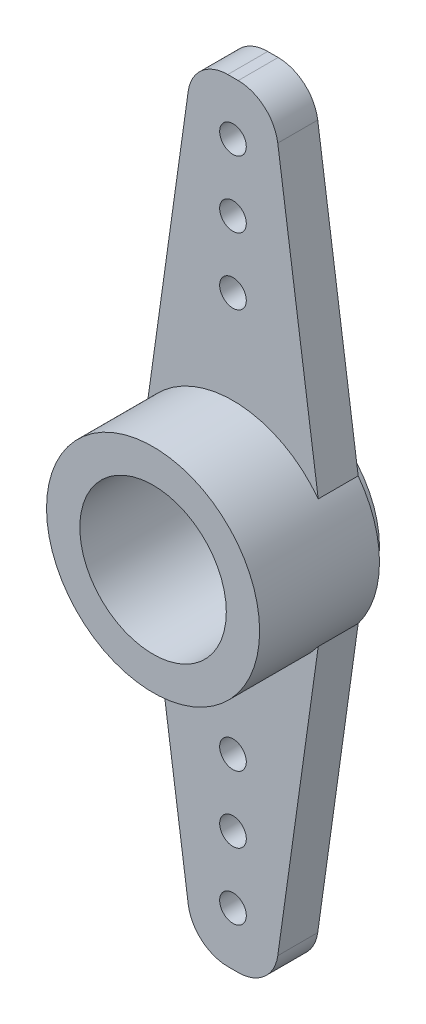
ISO-10303-21;
HEADER;
FILE_DESCRIPTION(('STEP AP214'),'2;1');
FILE_NAME('part.step','',(''),(''),'','','');
FILE_SCHEMA(('AUTOMOTIVE_DESIGN { 1 0 10303 214 1 1 1 1 }'));
ENDSEC;
DATA;
#1=APPLICATION_CONTEXT('core data for automotive mechanical design processes');
#2=APPLICATION_PROTOCOL_DEFINITION('international standard','automotive_design',2000,#1);
#3=PRODUCT_CONTEXT('',#1,'mechanical');
#4=PRODUCT('Part','Part','',(#3));
#5=PRODUCT_RELATED_PRODUCT_CATEGORY('part','',(#4));
#6=PRODUCT_DEFINITION_FORMATION('','',#4);
#7=PRODUCT_DEFINITION_CONTEXT('part definition',#1,'design');
#8=PRODUCT_DEFINITION('design','',#6,#7);
#9=PRODUCT_DEFINITION_SHAPE('','',#8);
#10=(LENGTH_UNIT() NAMED_UNIT(*) SI_UNIT(.MILLI.,.METRE.));
#11=(NAMED_UNIT(*) PLANE_ANGLE_UNIT() SI_UNIT($,.RADIAN.));
#12=(NAMED_UNIT(*) SI_UNIT($,.STERADIAN.) SOLID_ANGLE_UNIT());
#13=UNCERTAINTY_MEASURE_WITH_UNIT(LENGTH_MEASURE(1.E-05),#10,'distance_accuracy_value','');
#14=(GEOMETRIC_REPRESENTATION_CONTEXT(3) GLOBAL_UNCERTAINTY_ASSIGNED_CONTEXT((#13)) GLOBAL_UNIT_ASSIGNED_CONTEXT((#10,
#11,#12)) REPRESENTATION_CONTEXT('',''));
#15=CARTESIAN_POINT('',(0.,0.,0.));
#16=DIRECTION('',(0.,0.,1.));
#17=DIRECTION('',(1.,0.,0.));
#18=AXIS2_PLACEMENT_3D('',#15,#16,#17);
#19=CARTESIAN_POINT('',(0.,0.,1.5));
#20=DIRECTION('',(0.,0.,-1.));
#21=DIRECTION('',(-1.,0.,0.));
#22=AXIS2_PLACEMENT_3D('',#19,#20,#21);
#23=CYLINDRICAL_SURFACE('',#22,1.5);
#24=CARTESIAN_POINT('',(0.,0.,0.));
#25=DIRECTION('',(0.,0.,1.));
#26=DIRECTION('',(1.,0.,0.));
#27=AXIS2_PLACEMENT_3D('',#24,#25,#26);
#28=CIRCLE('',#27,1.5);
#29=CARTESIAN_POINT('',(1.5,0.,0.));
#30=VERTEX_POINT('',#29);
#31=EDGE_CURVE('E159',#30,#30,#28,.T.);
#32=ORIENTED_EDGE('',*,*,#31,.F.);
#33=EDGE_LOOP('',(#32));
#34=FACE_BOUND('',#33,.T.);
#35=CARTESIAN_POINT('',(0.,0.,0.5));
#36=DIRECTION('',(0.,0.,1.));
#37=DIRECTION('',(1.,0.,0.));
#38=AXIS2_PLACEMENT_3D('',#35,#36,#37);
#39=CIRCLE('',#38,1.5);
#40=CARTESIAN_POINT('',(1.5,0.,0.5));
#41=VERTEX_POINT('',#40);
#42=EDGE_CURVE('E37',#41,#41,#39,.T.);
#43=ORIENTED_EDGE('',*,*,#42,.T.);
#44=EDGE_LOOP('',(#43));
#45=FACE_BOUND('',#44,.T.);
#46=ADVANCED_FACE('F33',(#34,#45),#23,.F.);
#47=CARTESIAN_POINT('',(0.,0.,1.5));
#48=DIRECTION('',(0.,0.,1.));
#49=DIRECTION('',(1.,0.,0.));
#50=AXIS2_PLACEMENT_3D('',#47,#48,#49);
#51=PLANE('',#50);
#52=CARTESIAN_POINT('',(0.,0.,1.5));
#53=DIRECTION('',(0.,0.,1.));
#54=DIRECTION('',(1.,0.,0.));
#55=AXIS2_PLACEMENT_3D('',#52,#53,#54);
#56=CIRCLE('',#55,4.);
#57=CARTESIAN_POINT('',(3.2,2.4,1.5));
#58=VERTEX_POINT('',#57);
#59=CARTESIAN_POINT('',(-3.2,2.4,1.5));
#60=VERTEX_POINT('',#59);
#61=EDGE_CURVE('E208',#58,#60,#56,.T.);
#62=ORIENTED_EDGE('',*,*,#61,.F.);
#63=DIRECTION('',(-0.139129433730637,0.99027420478865,0.));
#64=VECTOR('',#63,1.);
#65=CARTESIAN_POINT('',(3.2,2.4,1.5));
#66=LINE('',#65,#64);
#67=CARTESIAN_POINT('',(1.68142313586669,13.2086941505959,1.5));
#68=VERTEX_POINT('',#67);
#69=EDGE_CURVE('E322',#58,#68,#66,.T.);
#70=ORIENTED_EDGE('',*,*,#69,.T.);
#71=CARTESIAN_POINT('',(0.196011828683711,13.,1.5));
#72=DIRECTION('',(0.,0.,1.));
#73=DIRECTION('',(1.,0.,0.));
#74=AXIS2_PLACEMENT_3D('',#71,#72,#73);
#75=CIRCLE('',#74,1.5);
#76=CARTESIAN_POINT('',(0.196011828683702,14.5,1.5));
#77=VERTEX_POINT('',#76);
#78=EDGE_CURVE('E137',#68,#77,#75,.T.);
#79=ORIENTED_EDGE('',*,*,#78,.T.);
#80=DIRECTION('',(-1.,0.,0.));
#81=VECTOR('',#80,1.);
#82=CARTESIAN_POINT('',(-0.196011828683702,14.5,1.5));
#83=LINE('',#82,#81);
#84=CARTESIAN_POINT('',(-0.196011828683702,14.5,1.5));
#85=VERTEX_POINT('',#84);
#86=EDGE_CURVE('E130',#77,#85,#83,.T.);
#87=ORIENTED_EDGE('',*,*,#86,.T.);
#88=CARTESIAN_POINT('',(-0.196011828683711,13.,1.5));
#89=DIRECTION('',(0.,0.,1.));
#90=DIRECTION('',(1.,0.,0.));
#91=AXIS2_PLACEMENT_3D('',#88,#89,#90);
#92=CIRCLE('',#91,1.5);
#93=CARTESIAN_POINT('',(-1.68142313586669,13.2086941505959,1.5));
#94=VERTEX_POINT('',#93);
#95=EDGE_CURVE('E135',#85,#94,#92,.T.);
#96=ORIENTED_EDGE('',*,*,#95,.T.);
#97=DIRECTION('',(-0.139129433730637,-0.99027420478865,0.));
#98=VECTOR('',#97,1.);
#99=CARTESIAN_POINT('',(-3.2,2.4,1.5));
#100=LINE('',#99,#98);
#101=EDGE_CURVE('E51',#94,#60,#100,.T.);
#102=ORIENTED_EDGE('',*,*,#101,.T.);
#103=EDGE_LOOP('',(#62,#70,#79,#87,#96,#102));
#104=FACE_BOUND('',#103,.T.);
#105=CARTESIAN_POINT('',(0.,12.5,1.5));
#106=DIRECTION('',(0.,0.,1.));
#107=DIRECTION('',(1.,0.,0.));
#108=AXIS2_PLACEMENT_3D('',#105,#106,#107);
#109=CIRCLE('',#108,0.5);
#110=CARTESIAN_POINT('',(0.5,12.5,1.5));
#111=VERTEX_POINT('',#110);
#112=EDGE_CURVE('E338',#111,#111,#109,.T.);
#113=ORIENTED_EDGE('',*,*,#112,.F.);
#114=EDGE_LOOP('',(#113));
#115=FACE_BOUND('',#114,.T.);
#116=CARTESIAN_POINT('',(0.,10.,1.5));
#117=DIRECTION('',(0.,0.,1.));
#118=DIRECTION('',(1.,0.,0.));
#119=AXIS2_PLACEMENT_3D('',#116,#117,#118);
#120=CIRCLE('',#119,0.5);
#121=CARTESIAN_POINT('',(0.5,10.,1.5));
#122=VERTEX_POINT('',#121);
#123=EDGE_CURVE('E334',#122,#122,#120,.T.);
#124=ORIENTED_EDGE('',*,*,#123,.F.);
#125=EDGE_LOOP('',(#124));
#126=FACE_BOUND('',#125,.T.);
#127=CARTESIAN_POINT('',(0.,7.5,1.5));
#128=DIRECTION('',(0.,0.,1.));
#129=DIRECTION('',(1.,0.,0.));
#130=AXIS2_PLACEMENT_3D('',#127,#128,#129);
#131=CIRCLE('',#130,0.5);
#132=CARTESIAN_POINT('',(0.5,7.5,1.5));
#133=VERTEX_POINT('',#132);
#134=EDGE_CURVE('E344',#133,#133,#131,.T.);
#135=ORIENTED_EDGE('',*,*,#134,.F.);
#136=EDGE_LOOP('',(#135));
#137=FACE_BOUND('',#136,.T.);
#138=ADVANCED_FACE('F132',(#104,#115,#126,#137),#51,.T.);
#139=CARTESIAN_POINT('',(-3.19999999999998,-2.40000000000005,1.5));
#140=VERTEX_POINT('',#139);
#141=CARTESIAN_POINT('',(3.20000000000001,-2.4,1.5));
#142=VERTEX_POINT('',#141);
#143=EDGE_CURVE('E43',#140,#142,#56,.T.);
#144=ORIENTED_EDGE('',*,*,#143,.F.);
#145=DIRECTION('',(0.139129433730644,-0.990274204788649,0.));
#146=VECTOR('',#145,1.);
#147=CARTESIAN_POINT('',(-3.19999999999998,-2.40000000000005,1.5));
#148=LINE('',#147,#146);
#149=CARTESIAN_POINT('',(-1.68142313586659,-13.208694150596,1.5));
#150=VERTEX_POINT('',#149);
#151=EDGE_CURVE('E178',#140,#150,#148,.T.);
#152=ORIENTED_EDGE('',*,*,#151,.T.);
#153=CARTESIAN_POINT('',(-0.19601182868362,-13.,1.5));
#154=DIRECTION('',(0.,0.,1.));
#155=DIRECTION('',(-1.,0.,0.));
#156=AXIS2_PLACEMENT_3D('',#153,#154,#155);
#157=CIRCLE('',#156,1.5);
#158=CARTESIAN_POINT('',(-0.1960118286836,-14.5,1.5));
#159=VERTEX_POINT('',#158);
#160=EDGE_CURVE('E329',#150,#159,#157,.T.);
#161=ORIENTED_EDGE('',*,*,#160,.T.);
#162=DIRECTION('',(1.,0.,0.));
#163=VECTOR('',#162,1.);
#164=CARTESIAN_POINT('',(-0.1960118286836,-14.5,1.5));
#165=LINE('',#164,#163);
#166=CARTESIAN_POINT('',(0.196011828683802,-14.5,1.5));
#167=VERTEX_POINT('',#166);
#168=EDGE_CURVE('E311',#159,#167,#165,.T.);
#169=ORIENTED_EDGE('',*,*,#168,.T.);
#170=CARTESIAN_POINT('',(0.196011828683801,-13.,1.5));
#171=DIRECTION('',(0.,0.,1.));
#172=DIRECTION('',(-1.,0.,0.));
#173=AXIS2_PLACEMENT_3D('',#170,#171,#172);
#174=CIRCLE('',#173,1.5);
#175=CARTESIAN_POINT('',(1.68142313586678,-13.208694150596,1.5));
#176=VERTEX_POINT('',#175);
#177=EDGE_CURVE('E323',#167,#176,#174,.T.);
#178=ORIENTED_EDGE('',*,*,#177,.T.);
#179=DIRECTION('',(0.13912943373063,0.990274204788651,0.));
#180=VECTOR('',#179,1.);
#181=CARTESIAN_POINT('',(3.20000000000002,-2.4,1.5));
#182=LINE('',#181,#180);
#183=EDGE_CURVE('E321',#176,#142,#182,.T.);
#184=ORIENTED_EDGE('',*,*,#183,.T.);
#185=EDGE_LOOP('',(#144,#152,#161,#169,#178,#184));
#186=FACE_BOUND('',#185,.T.);
#187=CARTESIAN_POINT('',(0.,-12.5,1.5));
#188=DIRECTION('',(0.,0.,1.));
#189=DIRECTION('',(-1.,0.,0.));
#190=AXIS2_PLACEMENT_3D('',#187,#188,#189);
#191=CIRCLE('',#190,0.500000000000001);
#192=CARTESIAN_POINT('',(-0.499999999999914,-12.5,1.5));
#193=VERTEX_POINT('',#192);
#194=EDGE_CURVE('E356',#193,#193,#191,.T.);
#195=ORIENTED_EDGE('',*,*,#194,.F.);
#196=EDGE_LOOP('',(#195));
#197=FACE_BOUND('',#196,.T.);
#198=CARTESIAN_POINT('',(0.,-7.50000000000003,1.5));
#199=DIRECTION('',(0.,0.,1.));
#200=DIRECTION('',(-1.,0.,0.));
#201=AXIS2_PLACEMENT_3D('',#198,#199,#200);
#202=CIRCLE('',#201,0.500000000000001);
#203=CARTESIAN_POINT('',(-0.499999999999949,-7.50000000000003,1.5));
#204=VERTEX_POINT('',#203);
#205=EDGE_CURVE('E350',#204,#204,#202,.T.);
#206=ORIENTED_EDGE('',*,*,#205,.F.);
#207=EDGE_LOOP('',(#206));
#208=FACE_BOUND('',#207,.T.);
#209=CARTESIAN_POINT('',(0.,-10.,1.5));
#210=DIRECTION('',(0.,0.,1.));
#211=DIRECTION('',(-1.,0.,0.));
#212=AXIS2_PLACEMENT_3D('',#209,#210,#211);
#213=CIRCLE('',#212,0.500000000000001);
#214=CARTESIAN_POINT('',(-0.499999999999931,-10.,1.5));
#215=VERTEX_POINT('',#214);
#216=EDGE_CURVE('E362',#215,#215,#213,.T.);
#217=ORIENTED_EDGE('',*,*,#216,.F.);
#218=EDGE_LOOP('',(#217));
#219=FACE_BOUND('',#218,.T.);
#220=ADVANCED_FACE('F256',(#186,#197,#208,#219),#51,.T.);
#221=CARTESIAN_POINT('',(0.,0.,0.));
#222=DIRECTION('',(0.,0.,1.));
#223=DIRECTION('',(1.,0.,0.));
#224=AXIS2_PLACEMENT_3D('',#221,#222,#223);
#225=PLANE('',#224);
#226=CARTESIAN_POINT('',(0.,0.,0.));
#227=DIRECTION('',(0.,0.,1.));
#228=DIRECTION('',(1.,0.,0.));
#229=AXIS2_PLACEMENT_3D('',#226,#227,#228);
#230=CIRCLE('',#229,3.5);
#231=CARTESIAN_POINT('',(3.5,0.,0.));
#232=VERTEX_POINT('',#231);
#233=EDGE_CURVE('E11',#232,#232,#230,.F.);
#234=ORIENTED_EDGE('',*,*,#233,.F.);
#235=EDGE_LOOP('',(#234));
#236=FACE_BOUND('',#235,.T.);
#237=CARTESIAN_POINT('',(0.,0.,0.));
#238=DIRECTION('',(0.,0.,1.));
#239=DIRECTION('',(1.,0.,0.));
#240=AXIS2_PLACEMENT_3D('',#237,#238,#239);
#241=CIRCLE('',#240,4.00000000000001);
#242=CARTESIAN_POINT('',(-3.2,2.4,0.));
#243=VERTEX_POINT('',#242);
#244=CARTESIAN_POINT('',(-3.19999999999998,-2.40000000000005,0.));
#245=VERTEX_POINT('',#244);
#246=EDGE_CURVE('E155',#243,#245,#241,.T.);
#247=ORIENTED_EDGE('',*,*,#246,.F.);
#248=DIRECTION('',(-0.139129433730637,-0.99027420478865,0.));
#249=VECTOR('',#248,1.);
#250=CARTESIAN_POINT('',(-3.2,2.4,0.));
#251=LINE('',#250,#249);
#252=CARTESIAN_POINT('',(-1.68142313586669,13.2086941505959,0.));
#253=VERTEX_POINT('',#252);
#254=EDGE_CURVE('E99',#253,#243,#251,.T.);
#255=ORIENTED_EDGE('',*,*,#254,.F.);
#256=CARTESIAN_POINT('',(-0.196011828683711,13.,0.));
#257=DIRECTION('',(0.,0.,1.));
#258=DIRECTION('',(1.,0.,0.));
#259=AXIS2_PLACEMENT_3D('',#256,#257,#258);
#260=CIRCLE('',#259,1.5);
#261=CARTESIAN_POINT('',(-0.196011828683702,14.5,0.));
#262=VERTEX_POINT('',#261);
#263=EDGE_CURVE('E93',#262,#253,#260,.T.);
#264=ORIENTED_EDGE('',*,*,#263,.F.);
#265=DIRECTION('',(-1.,0.,0.));
#266=VECTOR('',#265,1.);
#267=CARTESIAN_POINT('',(-0.196011828683702,14.5,0.));
#268=LINE('',#267,#266);
#269=CARTESIAN_POINT('',(0.196011828683702,14.5,0.));
#270=VERTEX_POINT('',#269);
#271=EDGE_CURVE('E145',#270,#262,#268,.T.);
#272=ORIENTED_EDGE('',*,*,#271,.F.);
#273=CARTESIAN_POINT('',(0.196011828683711,13.,0.));
#274=DIRECTION('',(0.,0.,1.));
#275=DIRECTION('',(1.,0.,0.));
#276=AXIS2_PLACEMENT_3D('',#273,#274,#275);
#277=CIRCLE('',#276,1.5);
#278=CARTESIAN_POINT('',(1.68142313586669,13.2086941505959,0.));
#279=VERTEX_POINT('',#278);
#280=EDGE_CURVE('E173',#279,#270,#277,.T.);
#281=ORIENTED_EDGE('',*,*,#280,.F.);
#282=DIRECTION('',(-0.139129433730637,0.99027420478865,0.));
#283=VECTOR('',#282,1.);
#284=CARTESIAN_POINT('',(3.2,2.4,0.));
#285=LINE('',#284,#283);
#286=CARTESIAN_POINT('',(3.2,2.4,0.));
#287=VERTEX_POINT('',#286);
#288=EDGE_CURVE('E171',#287,#279,#285,.T.);
#289=ORIENTED_EDGE('',*,*,#288,.F.);
#290=CARTESIAN_POINT('',(0.,0.,0.));
#291=DIRECTION('',(0.,0.,1.));
#292=DIRECTION('',(1.,0.,0.));
#293=AXIS2_PLACEMENT_3D('',#290,#291,#292);
#294=CIRCLE('',#293,4.00000000000001);
#295=CARTESIAN_POINT('',(3.20000000000001,-2.4,0.));
#296=VERTEX_POINT('',#295);
#297=EDGE_CURVE('E169',#296,#287,#294,.T.);
#298=ORIENTED_EDGE('',*,*,#297,.F.);
#299=DIRECTION('',(0.13912943373063,0.990274204788651,0.));
#300=VECTOR('',#299,1.);
#301=CARTESIAN_POINT('',(3.20000000000002,-2.4,0.));
#302=LINE('',#301,#300);
#303=CARTESIAN_POINT('',(1.68142313586678,-13.208694150596,0.));
#304=VERTEX_POINT('',#303);
#305=EDGE_CURVE('E167',#304,#296,#302,.T.);
#306=ORIENTED_EDGE('',*,*,#305,.F.);
#307=CARTESIAN_POINT('',(0.196011828683801,-13.,0.));
#308=DIRECTION('',(0.,0.,1.));
#309=DIRECTION('',(-1.,0.,0.));
#310=AXIS2_PLACEMENT_3D('',#307,#308,#309);
#311=CIRCLE('',#310,1.5);
#312=CARTESIAN_POINT('',(0.196011828683802,-14.5,0.));
#313=VERTEX_POINT('',#312);
#314=EDGE_CURVE('E165',#313,#304,#311,.T.);
#315=ORIENTED_EDGE('',*,*,#314,.F.);
#316=DIRECTION('',(1.,0.,0.));
#317=VECTOR('',#316,1.);
#318=CARTESIAN_POINT('',(-0.1960118286836,-14.5,0.));
#319=LINE('',#318,#317);
#320=CARTESIAN_POINT('',(-0.1960118286836,-14.5,0.));
#321=VERTEX_POINT('',#320);
#322=EDGE_CURVE('E163',#321,#313,#319,.T.);
#323=ORIENTED_EDGE('',*,*,#322,.F.);
#324=CARTESIAN_POINT('',(-0.19601182868362,-13.,0.));
#325=DIRECTION('',(0.,0.,1.));
#326=DIRECTION('',(-1.,0.,0.));
#327=AXIS2_PLACEMENT_3D('',#324,#325,#326);
#328=CIRCLE('',#327,1.5);
#329=CARTESIAN_POINT('',(-1.68142313586659,-13.208694150596,0.));
#330=VERTEX_POINT('',#329);
#331=EDGE_CURVE('E161',#330,#321,#328,.T.);
#332=ORIENTED_EDGE('',*,*,#331,.F.);
#333=DIRECTION('',(0.139129433730644,-0.990274204788649,0.));
#334=VECTOR('',#333,1.);
#335=CARTESIAN_POINT('',(-3.19999999999998,-2.40000000000005,0.));
#336=LINE('',#335,#334);
#337=EDGE_CURVE('E158',#245,#330,#336,.T.);
#338=ORIENTED_EDGE('',*,*,#337,.F.);
#339=EDGE_LOOP('',(#247,#255,#264,#272,#281,#289,#298,#306,#315,#323,#332,#338));
#340=FACE_BOUND('',#339,.T.);
#341=CARTESIAN_POINT('',(0.,10.,0.));
#342=DIRECTION('',(0.,0.,1.));
#343=DIRECTION('',(1.,0.,0.));
#344=AXIS2_PLACEMENT_3D('',#341,#342,#343);
#345=CIRCLE('',#344,0.5);
#346=CARTESIAN_POINT('',(0.5,10.,0.));
#347=VERTEX_POINT('',#346);
#348=EDGE_CURVE('E335',#347,#347,#345,.T.);
#349=ORIENTED_EDGE('',*,*,#348,.T.);
#350=EDGE_LOOP('',(#349));
#351=FACE_BOUND('',#350,.T.);
#352=CARTESIAN_POINT('',(0.,12.5,0.));
#353=DIRECTION('',(0.,0.,1.));
#354=DIRECTION('',(1.,0.,0.));
#355=AXIS2_PLACEMENT_3D('',#352,#353,#354);
#356=CIRCLE('',#355,0.5);
#357=CARTESIAN_POINT('',(0.5,12.5,0.));
#358=VERTEX_POINT('',#357);
#359=EDGE_CURVE('E341',#358,#358,#356,.T.);
#360=ORIENTED_EDGE('',*,*,#359,.T.);
#361=EDGE_LOOP('',(#360));
#362=FACE_BOUND('',#361,.T.);
#363=CARTESIAN_POINT('',(0.,7.5,0.));
#364=DIRECTION('',(0.,0.,1.));
#365=DIRECTION('',(1.,0.,0.));
#366=AXIS2_PLACEMENT_3D('',#363,#364,#365);
#367=CIRCLE('',#366,0.5);
#368=CARTESIAN_POINT('',(0.5,7.5,0.));
#369=VERTEX_POINT('',#368);
#370=EDGE_CURVE('E347',#369,#369,#367,.T.);
#371=ORIENTED_EDGE('',*,*,#370,.T.);
#372=EDGE_LOOP('',(#371));
#373=FACE_BOUND('',#372,.T.);
#374=CARTESIAN_POINT('',(0.,-7.50000000000003,0.));
#375=DIRECTION('',(0.,0.,1.));
#376=DIRECTION('',(-1.,0.,0.));
#377=AXIS2_PLACEMENT_3D('',#374,#375,#376);
#378=CIRCLE('',#377,0.500000000000001);
#379=CARTESIAN_POINT('',(-0.499999999999949,-7.50000000000003,0.));
#380=VERTEX_POINT('',#379);
#381=EDGE_CURVE('E353',#380,#380,#378,.T.);
#382=ORIENTED_EDGE('',*,*,#381,.T.);
#383=EDGE_LOOP('',(#382));
#384=FACE_BOUND('',#383,.T.);
#385=CARTESIAN_POINT('',(0.,-12.5,0.));
#386=DIRECTION('',(0.,0.,1.));
#387=DIRECTION('',(-1.,0.,0.));
#388=AXIS2_PLACEMENT_3D('',#385,#386,#387);
#389=CIRCLE('',#388,0.500000000000001);
#390=CARTESIAN_POINT('',(-0.499999999999914,-12.5,0.));
#391=VERTEX_POINT('',#390);
#392=EDGE_CURVE('E359',#391,#391,#389,.T.);
#393=ORIENTED_EDGE('',*,*,#392,.T.);
#394=EDGE_LOOP('',(#393));
#395=FACE_BOUND('',#394,.T.);
#396=CARTESIAN_POINT('',(0.,-10.,0.));
#397=DIRECTION('',(0.,0.,1.));
#398=DIRECTION('',(-1.,0.,0.));
#399=AXIS2_PLACEMENT_3D('',#396,#397,#398);
#400=CIRCLE('',#399,0.500000000000001);
#401=CARTESIAN_POINT('',(-0.499999999999931,-10.,0.));
#402=VERTEX_POINT('',#401);
#403=EDGE_CURVE('E217',#402,#402,#400,.T.);
#404=ORIENTED_EDGE('',*,*,#403,.T.);
#405=EDGE_LOOP('',(#404));
#406=FACE_BOUND('',#405,.T.);
#407=ADVANCED_FACE('F264',(#236,#340,#351,#362,#373,#384,#395,#406),#225,.F.);
#408=CARTESIAN_POINT('',(-3.19999999999998,-2.40000000000005,1.5));
#409=DIRECTION('',(0.990274204788649,0.139129433730644,0.));
#410=DIRECTION('',(-0.139129433730644,0.990274204788649,0.));
#411=AXIS2_PLACEMENT_3D('',#408,#409,#410);
#412=PLANE('',#411);
#413=ORIENTED_EDGE('',*,*,#337,.T.);
#414=DIRECTION('',(0.,0.,-1.));
#415=VECTOR('',#414,1.);
#416=CARTESIAN_POINT('',(-1.68142313586659,-13.208694150596,1.5));
#417=LINE('',#416,#415);
#418=EDGE_CURVE('E200',#150,#330,#417,.T.);
#419=ORIENTED_EDGE('',*,*,#418,.F.);
#420=ORIENTED_EDGE('',*,*,#151,.F.);
#421=DIRECTION('',(0.,0.,-1.));
#422=VECTOR('',#421,1.);
#423=CARTESIAN_POINT('',(-3.19999999999998,-2.40000000000005,1.5));
#424=LINE('',#423,#422);
#425=EDGE_CURVE('E203',#140,#245,#424,.T.);
#426=ORIENTED_EDGE('',*,*,#425,.T.);
#427=EDGE_LOOP('',(#413,#419,#420,#426));
#428=FACE_BOUND('',#427,.T.);
#429=ADVANCED_FACE('F35',(#428),#412,.F.);
#430=CARTESIAN_POINT('',(-0.19601182868362,-13.,1.5));
#431=DIRECTION('',(0.,0.,-1.));
#432=DIRECTION('',(-1.,0.,0.));
#433=AXIS2_PLACEMENT_3D('',#430,#431,#432);
#434=CYLINDRICAL_SURFACE('',#433,1.5);
#435=ORIENTED_EDGE('',*,*,#331,.T.);
#436=DIRECTION('',(0.,0.,-1.));
#437=VECTOR('',#436,1.);
#438=CARTESIAN_POINT('',(-0.1960118286836,-14.5,1.5));
#439=LINE('',#438,#437);
#440=EDGE_CURVE('E197',#159,#321,#439,.T.);
#441=ORIENTED_EDGE('',*,*,#440,.F.);
#442=ORIENTED_EDGE('',*,*,#160,.F.);
#443=ORIENTED_EDGE('',*,*,#418,.T.);
#444=EDGE_LOOP('',(#435,#441,#442,#443));
#445=FACE_BOUND('',#444,.T.);
#446=ADVANCED_FACE('F296',(#445),#434,.T.);
#447=CARTESIAN_POINT('',(-0.1960118286836,-14.5,1.5));
#448=DIRECTION('',(0.,1.,0.));
#449=DIRECTION('',(0.,0.,1.));
#450=AXIS2_PLACEMENT_3D('',#447,#448,#449);
#451=PLANE('',#450);
#452=ORIENTED_EDGE('',*,*,#322,.T.);
#453=DIRECTION('',(0.,0.,-1.));
#454=VECTOR('',#453,1.);
#455=CARTESIAN_POINT('',(0.196011828683802,-14.5,1.5));
#456=LINE('',#455,#454);
#457=EDGE_CURVE('E194',#167,#313,#456,.T.);
#458=ORIENTED_EDGE('',*,*,#457,.F.);
#459=ORIENTED_EDGE('',*,*,#168,.F.);
#460=ORIENTED_EDGE('',*,*,#440,.T.);
#461=EDGE_LOOP('',(#452,#458,#459,#460));
#462=FACE_BOUND('',#461,.T.);
#463=ADVANCED_FACE('F293',(#462),#451,.F.);
#464=CARTESIAN_POINT('',(0.196011828683801,-13.,1.5));
#465=DIRECTION('',(0.,0.,-1.));
#466=DIRECTION('',(-1.,0.,0.));
#467=AXIS2_PLACEMENT_3D('',#464,#465,#466);
#468=CYLINDRICAL_SURFACE('',#467,1.5);
#469=ORIENTED_EDGE('',*,*,#314,.T.);
#470=DIRECTION('',(0.,0.,-1.));
#471=VECTOR('',#470,1.);
#472=CARTESIAN_POINT('',(1.68142313586678,-13.208694150596,1.5));
#473=LINE('',#472,#471);
#474=EDGE_CURVE('E191',#176,#304,#473,.T.);
#475=ORIENTED_EDGE('',*,*,#474,.F.);
#476=ORIENTED_EDGE('',*,*,#177,.F.);
#477=ORIENTED_EDGE('',*,*,#457,.T.);
#478=EDGE_LOOP('',(#469,#475,#476,#477));
#479=FACE_BOUND('',#478,.T.);
#480=ADVANCED_FACE('F289',(#479),#468,.T.);
#481=CARTESIAN_POINT('',(3.20000000000002,-2.4,1.5));
#482=DIRECTION('',(-0.990274204788651,0.13912943373063,0.));
#483=DIRECTION('',(-0.13912943373063,-0.990274204788651,0.));
#484=AXIS2_PLACEMENT_3D('',#481,#482,#483);
#485=PLANE('',#484);
#486=ORIENTED_EDGE('',*,*,#305,.T.);
#487=DIRECTION('',(0.,0.,-1.));
#488=VECTOR('',#487,1.);
#489=CARTESIAN_POINT('',(3.20000000000001,-2.4,1.5));
#490=LINE('',#489,#488);
#491=EDGE_CURVE('E188',#142,#296,#490,.T.);
#492=ORIENTED_EDGE('',*,*,#491,.F.);
#493=ORIENTED_EDGE('',*,*,#183,.F.);
#494=ORIENTED_EDGE('',*,*,#474,.T.);
#495=EDGE_LOOP('',(#486,#492,#493,#494));
#496=FACE_BOUND('',#495,.T.);
#497=ADVANCED_FACE('F286',(#496),#485,.F.);
#498=CARTESIAN_POINT('',(0.,0.,1.5));
#499=DIRECTION('',(0.,0.,-1.));
#500=DIRECTION('',(-1.,0.,0.));
#501=AXIS2_PLACEMENT_3D('',#498,#499,#500);
#502=CYLINDRICAL_SURFACE('',#501,4.00000000000001);
#503=ORIENTED_EDGE('',*,*,#297,.T.);
#504=DIRECTION('',(0.,0.,-1.));
#505=VECTOR('',#504,1.);
#506=CARTESIAN_POINT('',(3.2,2.4,1.5));
#507=LINE('',#506,#505);
#508=EDGE_CURVE('E185',#58,#287,#507,.T.);
#509=ORIENTED_EDGE('',*,*,#508,.F.);
#510=ORIENTED_EDGE('',*,*,#61,.T.);
#511=DIRECTION('',(0.,0.,-1.));
#512=VECTOR('',#511,1.);
#513=CARTESIAN_POINT('',(-3.2,2.4,1.5));
#514=LINE('',#513,#512);
#515=EDGE_CURVE('E151',#60,#243,#514,.T.);
#516=ORIENTED_EDGE('',*,*,#515,.T.);
#517=ORIENTED_EDGE('',*,*,#246,.T.);
#518=ORIENTED_EDGE('',*,*,#425,.F.);
#519=ORIENTED_EDGE('',*,*,#143,.T.);
#520=ORIENTED_EDGE('',*,*,#491,.T.);
#521=EDGE_LOOP('',(#503,#509,#510,#516,#517,#518,#519,#520));
#522=FACE_BOUND('',#521,.T.);
#523=CARTESIAN_POINT('',(0.,0.,4.5));
#524=DIRECTION('',(0.,0.,1.));
#525=DIRECTION('',(1.,0.,0.));
#526=AXIS2_PLACEMENT_3D('',#523,#524,#525);
#527=CIRCLE('',#526,4.);
#528=CARTESIAN_POINT('',(4.,0.,4.5));
#529=VERTEX_POINT('',#528);
#530=EDGE_CURVE('E213',#529,#529,#527,.T.);
#531=ORIENTED_EDGE('',*,*,#530,.F.);
#532=EDGE_LOOP('',(#531));
#533=FACE_BOUND('',#532,.T.);
#534=ADVANCED_FACE('F282',(#522,#533),#502,.T.);
#535=CARTESIAN_POINT('',(3.2,2.4,1.5));
#536=DIRECTION('',(-0.99027420478865,-0.139129433730637,0.));
#537=DIRECTION('',(0.139129433730637,-0.99027420478865,0.));
#538=AXIS2_PLACEMENT_3D('',#535,#536,#537);
#539=PLANE('',#538);
#540=ORIENTED_EDGE('',*,*,#288,.T.);
#541=DIRECTION('',(0.,0.,-1.));
#542=VECTOR('',#541,1.);
#543=CARTESIAN_POINT('',(1.68142313586669,13.2086941505959,1.5));
#544=LINE('',#543,#542);
#545=EDGE_CURVE('E182',#68,#279,#544,.T.);
#546=ORIENTED_EDGE('',*,*,#545,.F.);
#547=ORIENTED_EDGE('',*,*,#69,.F.);
#548=ORIENTED_EDGE('',*,*,#508,.T.);
#549=EDGE_LOOP('',(#540,#546,#547,#548));
#550=FACE_BOUND('',#549,.T.);
#551=ADVANCED_FACE('F278',(#550),#539,.F.);
#552=CARTESIAN_POINT('',(0.196011828683711,13.,1.5));
#553=DIRECTION('',(0.,0.,-1.));
#554=DIRECTION('',(-1.,0.,0.));
#555=AXIS2_PLACEMENT_3D('',#552,#553,#554);
#556=CYLINDRICAL_SURFACE('',#555,1.5);
#557=ORIENTED_EDGE('',*,*,#280,.T.);
#558=DIRECTION('',(0.,0.,-1.));
#559=VECTOR('',#558,1.);
#560=CARTESIAN_POINT('',(0.196011828683702,14.5,1.5));
#561=LINE('',#560,#559);
#562=EDGE_CURVE('E146',#77,#270,#561,.T.);
#563=ORIENTED_EDGE('',*,*,#562,.F.);
#564=ORIENTED_EDGE('',*,*,#78,.F.);
#565=ORIENTED_EDGE('',*,*,#545,.T.);
#566=EDGE_LOOP('',(#557,#563,#564,#565));
#567=FACE_BOUND('',#566,.T.);
#568=ADVANCED_FACE('F275',(#567),#556,.T.);
#569=CARTESIAN_POINT('',(-0.196011828683702,14.5,1.5));
#570=DIRECTION('',(0.,-1.,0.));
#571=DIRECTION('',(0.,0.,-1.));
#572=AXIS2_PLACEMENT_3D('',#569,#570,#571);
#573=PLANE('',#572);
#574=ORIENTED_EDGE('',*,*,#271,.T.);
#575=DIRECTION('',(0.,0.,-1.));
#576=VECTOR('',#575,1.);
#577=CARTESIAN_POINT('',(-0.196011828683702,14.5,1.5));
#578=LINE('',#577,#576);
#579=EDGE_CURVE('E142',#85,#262,#578,.T.);
#580=ORIENTED_EDGE('',*,*,#579,.F.);
#581=ORIENTED_EDGE('',*,*,#86,.F.);
#582=ORIENTED_EDGE('',*,*,#562,.T.);
#583=EDGE_LOOP('',(#574,#580,#581,#582));
#584=FACE_BOUND('',#583,.T.);
#585=ADVANCED_FACE('F143',(#584),#573,.F.);
#586=CARTESIAN_POINT('',(-0.196011828683711,13.,1.5));
#587=DIRECTION('',(0.,0.,-1.));
#588=DIRECTION('',(-1.,0.,0.));
#589=AXIS2_PLACEMENT_3D('',#586,#587,#588);
#590=CYLINDRICAL_SURFACE('',#589,1.5);
#591=ORIENTED_EDGE('',*,*,#263,.T.);
#592=DIRECTION('',(0.,0.,-1.));
#593=VECTOR('',#592,1.);
#594=CARTESIAN_POINT('',(-1.68142313586669,13.2086941505959,1.5));
#595=LINE('',#594,#593);
#596=EDGE_CURVE('E147',#94,#253,#595,.T.);
#597=ORIENTED_EDGE('',*,*,#596,.F.);
#598=ORIENTED_EDGE('',*,*,#95,.F.);
#599=ORIENTED_EDGE('',*,*,#579,.T.);
#600=EDGE_LOOP('',(#591,#597,#598,#599));
#601=FACE_BOUND('',#600,.T.);
#602=ADVANCED_FACE('F149',(#601),#590,.T.);
#603=CARTESIAN_POINT('',(-3.2,2.4,1.5));
#604=DIRECTION('',(0.99027420478865,-0.139129433730637,0.));
#605=DIRECTION('',(0.139129433730637,0.99027420478865,0.));
#606=AXIS2_PLACEMENT_3D('',#603,#604,#605);
#607=PLANE('',#606);
#608=ORIENTED_EDGE('',*,*,#254,.T.);
#609=ORIENTED_EDGE('',*,*,#515,.F.);
#610=ORIENTED_EDGE('',*,*,#101,.F.);
#611=ORIENTED_EDGE('',*,*,#596,.T.);
#612=EDGE_LOOP('',(#608,#609,#610,#611));
#613=FACE_BOUND('',#612,.T.);
#614=ADVANCED_FACE('F268',(#613),#607,.F.);
#615=CARTESIAN_POINT('',(0.,10.,1.5));
#616=DIRECTION('',(0.,0.,-1.));
#617=DIRECTION('',(-1.,0.,0.));
#618=AXIS2_PLACEMENT_3D('',#615,#616,#617);
#619=CYLINDRICAL_SURFACE('',#618,0.5);
#620=ORIENTED_EDGE('',*,*,#123,.T.);
#621=EDGE_LOOP('',(#620));
#622=FACE_BOUND('',#621,.T.);
#623=ORIENTED_EDGE('',*,*,#348,.F.);
#624=EDGE_LOOP('',(#623));
#625=FACE_BOUND('',#624,.T.);
#626=ADVANCED_FACE('F260',(#622,#625),#619,.F.);
#627=CARTESIAN_POINT('',(0.,12.5,1.5));
#628=DIRECTION('',(0.,0.,-1.));
#629=DIRECTION('',(-1.,0.,0.));
#630=AXIS2_PLACEMENT_3D('',#627,#628,#629);
#631=CYLINDRICAL_SURFACE('',#630,0.5);
#632=ORIENTED_EDGE('',*,*,#112,.T.);
#633=EDGE_LOOP('',(#632));
#634=FACE_BOUND('',#633,.T.);
#635=ORIENTED_EDGE('',*,*,#359,.F.);
#636=EDGE_LOOP('',(#635));
#637=FACE_BOUND('',#636,.T.);
#638=ADVANCED_FACE('F395',(#634,#637),#631,.F.);
#639=CARTESIAN_POINT('',(0.,7.5,1.5));
#640=DIRECTION('',(0.,0.,-1.));
#641=DIRECTION('',(-1.,0.,0.));
#642=AXIS2_PLACEMENT_3D('',#639,#640,#641);
#643=CYLINDRICAL_SURFACE('',#642,0.5);
#644=ORIENTED_EDGE('',*,*,#134,.T.);
#645=EDGE_LOOP('',(#644));
#646=FACE_BOUND('',#645,.T.);
#647=ORIENTED_EDGE('',*,*,#370,.F.);
#648=EDGE_LOOP('',(#647));
#649=FACE_BOUND('',#648,.T.);
#650=ADVANCED_FACE('F392',(#646,#649),#643,.F.);
#651=CARTESIAN_POINT('',(0.,-7.50000000000003,1.5));
#652=DIRECTION('',(0.,0.,-1.));
#653=DIRECTION('',(-1.,0.,0.));
#654=AXIS2_PLACEMENT_3D('',#651,#652,#653);
#655=CYLINDRICAL_SURFACE('',#654,0.500000000000001);
#656=ORIENTED_EDGE('',*,*,#205,.T.);
#657=EDGE_LOOP('',(#656));
#658=FACE_BOUND('',#657,.T.);
#659=ORIENTED_EDGE('',*,*,#381,.F.);
#660=EDGE_LOOP('',(#659));
#661=FACE_BOUND('',#660,.T.);
#662=ADVANCED_FACE('F385',(#658,#661),#655,.F.);
#663=CARTESIAN_POINT('',(0.,-12.5,1.5));
#664=DIRECTION('',(0.,0.,-1.));
#665=DIRECTION('',(-1.,0.,0.));
#666=AXIS2_PLACEMENT_3D('',#663,#664,#665);
#667=CYLINDRICAL_SURFACE('',#666,0.500000000000001);
#668=ORIENTED_EDGE('',*,*,#194,.T.);
#669=EDGE_LOOP('',(#668));
#670=FACE_BOUND('',#669,.T.);
#671=ORIENTED_EDGE('',*,*,#392,.F.);
#672=EDGE_LOOP('',(#671));
#673=FACE_BOUND('',#672,.T.);
#674=ADVANCED_FACE('F374',(#670,#673),#667,.F.);
#675=CARTESIAN_POINT('',(0.,-10.,1.5));
#676=DIRECTION('',(0.,0.,-1.));
#677=DIRECTION('',(-1.,0.,0.));
#678=AXIS2_PLACEMENT_3D('',#675,#676,#677);
#679=CYLINDRICAL_SURFACE('',#678,0.500000000000001);
#680=ORIENTED_EDGE('',*,*,#216,.T.);
#681=EDGE_LOOP('',(#680));
#682=FACE_BOUND('',#681,.T.);
#683=ORIENTED_EDGE('',*,*,#403,.F.);
#684=EDGE_LOOP('',(#683));
#685=FACE_BOUND('',#684,.T.);
#686=ADVANCED_FACE('F369',(#682,#685),#679,.F.);
#687=CARTESIAN_POINT('',(0.,0.,4.5));
#688=DIRECTION('',(0.,0.,1.));
#689=DIRECTION('',(1.,0.,0.));
#690=AXIS2_PLACEMENT_3D('',#687,#688,#689);
#691=PLANE('',#690);
#692=CARTESIAN_POINT('',(0.,0.,4.5));
#693=DIRECTION('',(0.,0.,1.));
#694=DIRECTION('',(1.,0.,0.));
#695=AXIS2_PLACEMENT_3D('',#692,#693,#694);
#696=CIRCLE('',#695,2.75);
#697=CARTESIAN_POINT('',(2.75,0.,4.5));
#698=VERTEX_POINT('',#697);
#699=EDGE_CURVE('E229',#698,#698,#696,.T.);
#700=ORIENTED_EDGE('',*,*,#699,.F.);
#701=EDGE_LOOP('',(#700));
#702=FACE_BOUND('',#701,.T.);
#703=ORIENTED_EDGE('',*,*,#530,.T.);
#704=EDGE_LOOP('',(#703));
#705=FACE_BOUND('',#704,.T.);
#706=ADVANCED_FACE('F373',(#702,#705),#691,.T.);
#707=CARTESIAN_POINT('',(0.,0.,-0.5));
#708=DIRECTION('',(0.,0.,-1.));
#709=DIRECTION('',(-1.,0.,0.));
#710=AXIS2_PLACEMENT_3D('',#707,#708,#709);
#711=PLANE('',#710);
#712=CARTESIAN_POINT('',(0.,0.,-0.5));
#713=DIRECTION('',(0.,0.,-1.));
#714=DIRECTION('',(-1.,0.,0.));
#715=AXIS2_PLACEMENT_3D('',#712,#713,#714);
#716=CIRCLE('',#715,3.5);
#717=CARTESIAN_POINT('',(-3.5,0.,-0.5));
#718=VERTEX_POINT('',#717);
#719=EDGE_CURVE('E214',#718,#718,#716,.T.);
#720=ORIENTED_EDGE('',*,*,#719,.T.);
#721=EDGE_LOOP('',(#720));
#722=FACE_BOUND('',#721,.T.);
#723=CARTESIAN_POINT('',(0.,0.,-0.5));
#724=DIRECTION('',(0.,0.,-1.));
#725=DIRECTION('',(-1.,0.,0.));
#726=AXIS2_PLACEMENT_3D('',#723,#724,#725);
#727=CIRCLE('',#726,3.25);
#728=CARTESIAN_POINT('',(-3.25,0.,-0.5));
#729=VERTEX_POINT('',#728);
#730=EDGE_CURVE('E219',#729,#729,#727,.T.);
#731=ORIENTED_EDGE('',*,*,#730,.F.);
#732=EDGE_LOOP('',(#731));
#733=FACE_BOUND('',#732,.T.);
#734=ADVANCED_FACE('F382',(#722,#733),#711,.T.);
#735=CARTESIAN_POINT('',(0.,0.,-0.5));
#736=DIRECTION('',(0.,0.,1.));
#737=DIRECTION('',(1.,0.,0.));
#738=AXIS2_PLACEMENT_3D('',#735,#736,#737);
#739=CYLINDRICAL_SURFACE('',#738,3.5);
#740=ORIENTED_EDGE('',*,*,#719,.F.);
#741=EDGE_LOOP('',(#740));
#742=FACE_BOUND('',#741,.T.);
#743=ORIENTED_EDGE('',*,*,#233,.T.);
#744=EDGE_LOOP('',(#743));
#745=FACE_BOUND('',#744,.T.);
#746=ADVANCED_FACE('F561',(#742,#745),#739,.T.);
#747=CARTESIAN_POINT('',(0.,0.,-0.5));
#748=DIRECTION('',(0.,0.,1.));
#749=DIRECTION('',(1.,0.,0.));
#750=AXIS2_PLACEMENT_3D('',#747,#748,#749);
#751=CYLINDRICAL_SURFACE('',#750,3.25);
#752=ORIENTED_EDGE('',*,*,#730,.T.);
#753=EDGE_LOOP('',(#752));
#754=FACE_BOUND('',#753,.T.);
#755=CARTESIAN_POINT('',(0.,0.,0.));
#756=DIRECTION('',(0.,0.,-1.));
#757=DIRECTION('',(-1.,0.,0.));
#758=AXIS2_PLACEMENT_3D('',#755,#756,#757);
#759=CIRCLE('',#758,3.25);
#760=CARTESIAN_POINT('',(-3.25,0.,0.));
#761=VERTEX_POINT('',#760);
#762=EDGE_CURVE('E224',#761,#761,#759,.T.);
#763=ORIENTED_EDGE('',*,*,#762,.F.);
#764=EDGE_LOOP('',(#763));
#765=FACE_BOUND('',#764,.T.);
#766=ADVANCED_FACE('F553',(#754,#765),#751,.F.);
#767=ORIENTED_EDGE('',*,*,#31,.T.);
#768=EDGE_LOOP('',(#767));
#769=FACE_BOUND('',#768,.T.);
#770=ORIENTED_EDGE('',*,*,#762,.T.);
#771=EDGE_LOOP('',(#770));
#772=FACE_BOUND('',#771,.T.);
#773=ADVANCED_FACE('F247',(#769,#772),#225,.F.);
#774=CARTESIAN_POINT('',(0.,0.,0.5));
#775=DIRECTION('',(0.,0.,1.));
#776=DIRECTION('',(1.,0.,0.));
#777=AXIS2_PLACEMENT_3D('',#774,#775,#776);
#778=CYLINDRICAL_SURFACE('',#777,2.75);
#779=CARTESIAN_POINT('',(0.,0.,0.5));
#780=DIRECTION('',(0.,0.,1.));
#781=DIRECTION('',(1.,0.,0.));
#782=AXIS2_PLACEMENT_3D('',#779,#780,#781);
#783=CIRCLE('',#782,2.75);
#784=CARTESIAN_POINT('',(2.75,0.,0.5));
#785=VERTEX_POINT('',#784);
#786=EDGE_CURVE('E232',#785,#785,#783,.T.);
#787=ORIENTED_EDGE('',*,*,#786,.F.);
#788=EDGE_LOOP('',(#787));
#789=FACE_BOUND('',#788,.T.);
#790=ORIENTED_EDGE('',*,*,#699,.T.);
#791=EDGE_LOOP('',(#790));
#792=FACE_BOUND('',#791,.T.);
#793=ADVANCED_FACE('F242',(#789,#792),#778,.F.);
#794=CARTESIAN_POINT('',(0.,0.,0.5));
#795=DIRECTION('',(0.,0.,1.));
#796=DIRECTION('',(1.,0.,0.));
#797=AXIS2_PLACEMENT_3D('',#794,#795,#796);
#798=PLANE('',#797);
#799=ORIENTED_EDGE('',*,*,#42,.F.);
#800=EDGE_LOOP('',(#799));
#801=FACE_BOUND('',#800,.T.);
#802=ORIENTED_EDGE('',*,*,#786,.T.);
#803=EDGE_LOOP('',(#802));
#804=FACE_BOUND('',#803,.T.);
#805=ADVANCED_FACE('F240',(#801,#804),#798,.T.);
#806=CLOSED_SHELL('',(#46,#138,#220,#407,#429,#446,#463,#480,#497,#534,#551,#568,#585,#602,#614,
#626,#638,#650,#662,#674,#686,#706,#734,#746,#766,#773,#793,#805));
#807=MANIFOLD_SOLID_BREP('B2',#806);
#808=ADVANCED_BREP_SHAPE_REPRESENTATION('',(#18,#807),#14);
#809=SHAPE_DEFINITION_REPRESENTATION(#9,#808);
ENDSEC;
END-ISO-10303-21;
